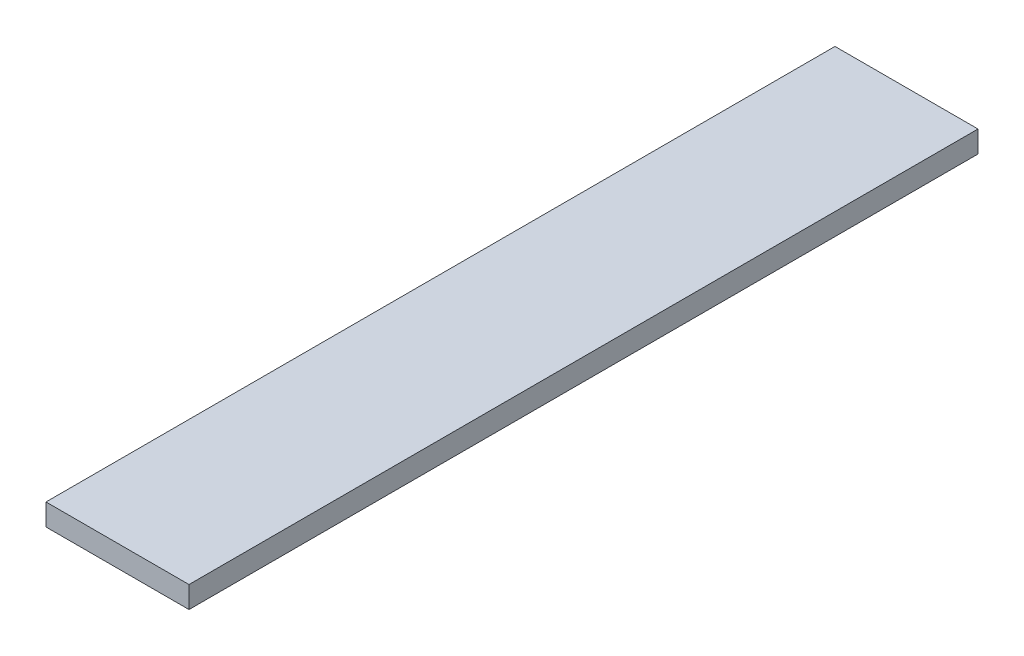
ISO-10303-21;
HEADER;
FILE_DESCRIPTION(('STEP AP214'),'2;1');
FILE_NAME('part.step','',(''),(''),'','','');
FILE_SCHEMA(('AUTOMOTIVE_DESIGN { 1 0 10303 214 1 1 1 1 }'));
ENDSEC;
DATA;
#1=APPLICATION_CONTEXT('core data for automotive mechanical design processes');
#2=APPLICATION_PROTOCOL_DEFINITION('international standard','automotive_design',2000,#1);
#3=PRODUCT_CONTEXT('',#1,'mechanical');
#4=PRODUCT('Part','Part','',(#3));
#5=PRODUCT_RELATED_PRODUCT_CATEGORY('part','',(#4));
#6=PRODUCT_DEFINITION_FORMATION('','',#4);
#7=PRODUCT_DEFINITION_CONTEXT('part definition',#1,'design');
#8=PRODUCT_DEFINITION('design','',#6,#7);
#9=PRODUCT_DEFINITION_SHAPE('','',#8);
#10=(LENGTH_UNIT() NAMED_UNIT(*) SI_UNIT(.MILLI.,.METRE.));
#11=(NAMED_UNIT(*) PLANE_ANGLE_UNIT() SI_UNIT($,.RADIAN.));
#12=(NAMED_UNIT(*) SI_UNIT($,.STERADIAN.) SOLID_ANGLE_UNIT());
#13=UNCERTAINTY_MEASURE_WITH_UNIT(LENGTH_MEASURE(1.E-05),#10,'distance_accuracy_value','');
#14=(GEOMETRIC_REPRESENTATION_CONTEXT(3) GLOBAL_UNCERTAINTY_ASSIGNED_CONTEXT((#13)) GLOBAL_UNIT_ASSIGNED_CONTEXT((#10,
#11,#12)) REPRESENTATION_CONTEXT('',''));
#15=CARTESIAN_POINT('',(0.,0.,0.));
#16=DIRECTION('',(0.,0.,1.));
#17=DIRECTION('',(1.,0.,0.));
#18=AXIS2_PLACEMENT_3D('',#15,#16,#17);
#19=CARTESIAN_POINT('',(72.5,22.,400.));
#20=DIRECTION('',(-1.,0.,0.));
#21=DIRECTION('',(0.,0.,1.));
#22=AXIS2_PLACEMENT_3D('',#19,#20,#21);
#23=PLANE('',#22);
#24=DIRECTION('',(0.,0.,-1.));
#25=VECTOR('',#24,1.);
#26=CARTESIAN_POINT('',(72.5,0.,400.));
#27=LINE('',#26,#25);
#28=CARTESIAN_POINT('',(72.5,0.,400.));
#29=VERTEX_POINT('',#28);
#30=CARTESIAN_POINT('',(72.5,0.,-400.));
#31=VERTEX_POINT('',#30);
#32=EDGE_CURVE('E105',#29,#31,#27,.T.);
#33=ORIENTED_EDGE('',*,*,#32,.T.);
#34=DIRECTION('',(0.,-1.,0.));
#35=VECTOR('',#34,1.);
#36=CARTESIAN_POINT('',(72.5,22.,-400.));
#37=LINE('',#36,#35);
#38=CARTESIAN_POINT('',(72.5,22.,-400.));
#39=VERTEX_POINT('',#38);
#40=EDGE_CURVE('E11',#39,#31,#37,.T.);
#41=ORIENTED_EDGE('',*,*,#40,.F.);
#42=DIRECTION('',(0.,0.,-1.));
#43=VECTOR('',#42,1.);
#44=CARTESIAN_POINT('',(72.5,22.,400.));
#45=LINE('',#44,#43);
#46=CARTESIAN_POINT('',(72.5,22.,400.));
#47=VERTEX_POINT('',#46);
#48=EDGE_CURVE('E88',#47,#39,#45,.T.);
#49=ORIENTED_EDGE('',*,*,#48,.F.);
#50=DIRECTION('',(0.,-1.,0.));
#51=VECTOR('',#50,1.);
#52=CARTESIAN_POINT('',(72.5,22.,400.));
#53=LINE('',#52,#51);
#54=EDGE_CURVE('E101',#47,#29,#53,.T.);
#55=ORIENTED_EDGE('',*,*,#54,.T.);
#56=EDGE_LOOP('',(#33,#41,#49,#55));
#57=FACE_BOUND('',#56,.T.);
#58=ADVANCED_FACE('F36',(#57),#23,.F.);
#59=CARTESIAN_POINT('',(-72.5,22.,-400.));
#60=DIRECTION('',(0.,0.,1.));
#61=DIRECTION('',(1.,0.,0.));
#62=AXIS2_PLACEMENT_3D('',#59,#60,#61);
#63=PLANE('',#62);
#64=DIRECTION('',(-1.,0.,0.));
#65=VECTOR('',#64,1.);
#66=CARTESIAN_POINT('',(-72.5,0.,-400.));
#67=LINE('',#66,#65);
#68=CARTESIAN_POINT('',(-72.5,0.,-400.));
#69=VERTEX_POINT('',#68);
#70=EDGE_CURVE('E93',#31,#69,#67,.T.);
#71=ORIENTED_EDGE('',*,*,#70,.T.);
#72=DIRECTION('',(0.,-1.,0.));
#73=VECTOR('',#72,1.);
#74=CARTESIAN_POINT('',(-72.5,22.,-400.));
#75=LINE('',#74,#73);
#76=CARTESIAN_POINT('',(-72.5,22.,-400.));
#77=VERTEX_POINT('',#76);
#78=EDGE_CURVE('E45',#77,#69,#75,.T.);
#79=ORIENTED_EDGE('',*,*,#78,.F.);
#80=DIRECTION('',(-1.,0.,0.));
#81=VECTOR('',#80,1.);
#82=CARTESIAN_POINT('',(-72.5,22.,-400.));
#83=LINE('',#82,#81);
#84=EDGE_CURVE('E83',#39,#77,#83,.T.);
#85=ORIENTED_EDGE('',*,*,#84,.F.);
#86=ORIENTED_EDGE('',*,*,#40,.T.);
#87=EDGE_LOOP('',(#71,#79,#85,#86));
#88=FACE_BOUND('',#87,.T.);
#89=ADVANCED_FACE('F92',(#88),#63,.F.);
#90=CARTESIAN_POINT('',(-72.5,22.,400.));
#91=DIRECTION('',(1.,0.,0.));
#92=DIRECTION('',(0.,0.,-1.));
#93=AXIS2_PLACEMENT_3D('',#90,#91,#92);
#94=PLANE('',#93);
#95=DIRECTION('',(0.,0.,1.));
#96=VECTOR('',#95,1.);
#97=CARTESIAN_POINT('',(-72.5,0.,400.));
#98=LINE('',#97,#96);
#99=CARTESIAN_POINT('',(-72.5,0.,400.));
#100=VERTEX_POINT('',#99);
#101=EDGE_CURVE('E70',#69,#100,#98,.T.);
#102=ORIENTED_EDGE('',*,*,#101,.T.);
#103=DIRECTION('',(0.,-1.,0.));
#104=VECTOR('',#103,1.);
#105=CARTESIAN_POINT('',(-72.5,22.,400.));
#106=LINE('',#105,#104);
#107=CARTESIAN_POINT('',(-72.5,22.,400.));
#108=VERTEX_POINT('',#107);
#109=EDGE_CURVE('E95',#108,#100,#106,.T.);
#110=ORIENTED_EDGE('',*,*,#109,.F.);
#111=DIRECTION('',(0.,0.,1.));
#112=VECTOR('',#111,1.);
#113=CARTESIAN_POINT('',(-72.5,22.,400.));
#114=LINE('',#113,#112);
#115=EDGE_CURVE('E86',#77,#108,#114,.T.);
#116=ORIENTED_EDGE('',*,*,#115,.F.);
#117=ORIENTED_EDGE('',*,*,#78,.T.);
#118=EDGE_LOOP('',(#102,#110,#116,#117));
#119=FACE_BOUND('',#118,.T.);
#120=ADVANCED_FACE('F96',(#119),#94,.F.);
#121=CARTESIAN_POINT('',(-72.5,22.,400.));
#122=DIRECTION('',(0.,0.,-1.));
#123=DIRECTION('',(-1.,0.,0.));
#124=AXIS2_PLACEMENT_3D('',#121,#122,#123);
#125=PLANE('',#124);
#126=DIRECTION('',(1.,0.,0.));
#127=VECTOR('',#126,1.);
#128=CARTESIAN_POINT('',(-72.5,0.,400.));
#129=LINE('',#128,#127);
#130=EDGE_CURVE('E76',#100,#29,#129,.T.);
#131=ORIENTED_EDGE('',*,*,#130,.T.);
#132=ORIENTED_EDGE('',*,*,#54,.F.);
#133=DIRECTION('',(1.,0.,0.));
#134=VECTOR('',#133,1.);
#135=CARTESIAN_POINT('',(-72.5,22.,400.));
#136=LINE('',#135,#134);
#137=EDGE_CURVE('E53',#108,#47,#136,.T.);
#138=ORIENTED_EDGE('',*,*,#137,.F.);
#139=ORIENTED_EDGE('',*,*,#109,.T.);
#140=EDGE_LOOP('',(#131,#132,#138,#139));
#141=FACE_BOUND('',#140,.T.);
#142=ADVANCED_FACE('F117',(#141),#125,.F.);
#143=CARTESIAN_POINT('',(0.,22.,0.));
#144=DIRECTION('',(0.,-1.,0.));
#145=DIRECTION('',(0.,0.,-1.));
#146=AXIS2_PLACEMENT_3D('',#143,#144,#145);
#147=PLANE('',#146);
#148=ORIENTED_EDGE('',*,*,#48,.T.);
#149=ORIENTED_EDGE('',*,*,#84,.T.);
#150=ORIENTED_EDGE('',*,*,#115,.T.);
#151=ORIENTED_EDGE('',*,*,#137,.T.);
#152=EDGE_LOOP('',(#148,#149,#150,#151));
#153=FACE_BOUND('',#152,.T.);
#154=ADVANCED_FACE('F84',(#153),#147,.F.);
#155=CARTESIAN_POINT('',(0.,0.,0.));
#156=DIRECTION('',(0.,-1.,0.));
#157=DIRECTION('',(0.,0.,-1.));
#158=AXIS2_PLACEMENT_3D('',#155,#156,#157);
#159=PLANE('',#158);
#160=ORIENTED_EDGE('',*,*,#32,.F.);
#161=ORIENTED_EDGE('',*,*,#130,.F.);
#162=ORIENTED_EDGE('',*,*,#101,.F.);
#163=ORIENTED_EDGE('',*,*,#70,.F.);
#164=EDGE_LOOP('',(#160,#161,#162,#163));
#165=FACE_BOUND('',#164,.T.);
#166=ADVANCED_FACE('F120',(#165),#159,.T.);
#167=CLOSED_SHELL('',(#58,#89,#120,#142,#154,#166));
#168=MANIFOLD_SOLID_BREP('B2',#167);
#169=ADVANCED_BREP_SHAPE_REPRESENTATION('',(#18,#168),#14);
#170=SHAPE_DEFINITION_REPRESENTATION(#9,#169);
ENDSEC;
END-ISO-10303-21;
